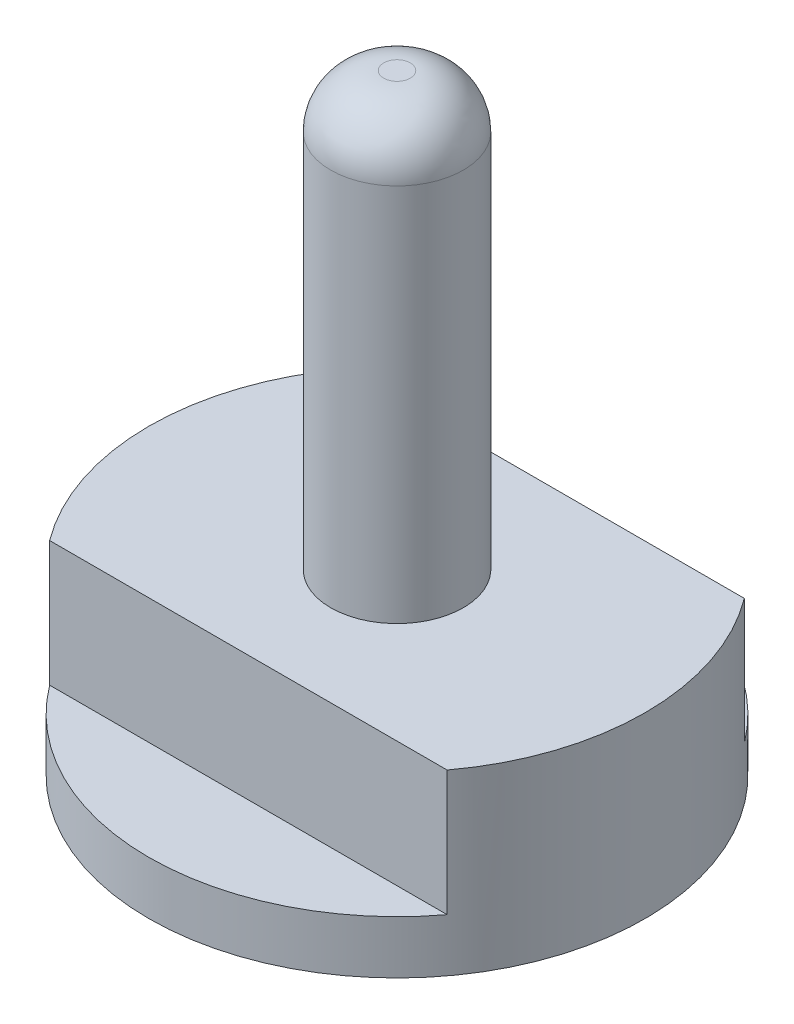
ISO-10303-21;
HEADER;
FILE_DESCRIPTION(('STEP AP214'),'2;1');
FILE_NAME('part.step','',(''),(''),'','','');
FILE_SCHEMA(('AUTOMOTIVE_DESIGN { 1 0 10303 214 1 1 1 1 }'));
ENDSEC;
DATA;
#1=APPLICATION_CONTEXT('core data for automotive mechanical design processes');
#2=APPLICATION_PROTOCOL_DEFINITION('international standard','automotive_design',2000,#1);
#3=PRODUCT_CONTEXT('',#1,'mechanical');
#4=PRODUCT('Part','Part','',(#3));
#5=PRODUCT_RELATED_PRODUCT_CATEGORY('part','',(#4));
#6=PRODUCT_DEFINITION_FORMATION('','',#4);
#7=PRODUCT_DEFINITION_CONTEXT('part definition',#1,'design');
#8=PRODUCT_DEFINITION('design','',#6,#7);
#9=PRODUCT_DEFINITION_SHAPE('','',#8);
#10=(LENGTH_UNIT() NAMED_UNIT(*) SI_UNIT(.MILLI.,.METRE.));
#11=(NAMED_UNIT(*) PLANE_ANGLE_UNIT() SI_UNIT($,.RADIAN.));
#12=(NAMED_UNIT(*) SI_UNIT($,.STERADIAN.) SOLID_ANGLE_UNIT());
#13=UNCERTAINTY_MEASURE_WITH_UNIT(LENGTH_MEASURE(1.E-05),#10,'distance_accuracy_value','');
#14=(GEOMETRIC_REPRESENTATION_CONTEXT(3) GLOBAL_UNCERTAINTY_ASSIGNED_CONTEXT((#13)) GLOBAL_UNIT_ASSIGNED_CONTEXT((#10,
#11,#12)) REPRESENTATION_CONTEXT('',''));
#15=CARTESIAN_POINT('',(0.,0.,0.));
#16=DIRECTION('',(0.,0.,1.));
#17=DIRECTION('',(1.,0.,0.));
#18=AXIS2_PLACEMENT_3D('',#15,#16,#17);
#19=CARTESIAN_POINT('',(3.74374478296798,-10.8987384591062,5.6));
#20=DIRECTION('',(0.,0.,-1.));
#21=DIRECTION('',(0.,1.,0.));
#22=AXIS2_PLACEMENT_3D('',#19,#20,#21);
#23=PLANE('',#22);
#24=DIRECTION('',(-1.,0.,0.));
#25=VECTOR('',#24,1.);
#26=CARTESIAN_POINT('',(3.74374478296798,0.999999999999999,5.6));
#27=LINE('',#26,#25);
#28=CARTESIAN_POINT('',(3.74374478296798,0.999999999999996,5.6));
#29=VERTEX_POINT('',#28);
#30=CARTESIAN_POINT('',(-3.74374478296798,0.999999999999996,5.6));
#31=VERTEX_POINT('',#30);
#32=EDGE_CURVE('E52',#29,#31,#27,.T.);
#33=ORIENTED_EDGE('',*,*,#32,.F.);
#34=DIRECTION('',(0.,1.,0.));
#35=VECTOR('',#34,1.);
#36=CARTESIAN_POINT('',(3.74374478296798,-10.8987384591062,5.6));
#37=LINE('',#36,#35);
#38=CARTESIAN_POINT('',(3.74374478296798,3.36,5.6));
#39=VERTEX_POINT('',#38);
#40=EDGE_CURVE('E98',#29,#39,#37,.T.);
#41=ORIENTED_EDGE('',*,*,#40,.T.);
#42=DIRECTION('',(-1.,0.,0.));
#43=VECTOR('',#42,1.);
#44=CARTESIAN_POINT('',(3.74374478296798,3.36,5.6));
#45=LINE('',#44,#43);
#46=CARTESIAN_POINT('',(-3.74374478296798,3.36,5.6));
#47=VERTEX_POINT('',#46);
#48=EDGE_CURVE('E175',#39,#47,#45,.T.);
#49=ORIENTED_EDGE('',*,*,#48,.T.);
#50=DIRECTION('',(0.,1.,0.));
#51=VECTOR('',#50,1.);
#52=CARTESIAN_POINT('',(-3.74374478296798,-10.8987384591062,5.6));
#53=LINE('',#52,#51);
#54=EDGE_CURVE('E57',#31,#47,#53,.T.);
#55=ORIENTED_EDGE('',*,*,#54,.F.);
#56=EDGE_LOOP('',(#33,#41,#49,#55));
#57=FACE_BOUND('',#56,.T.);
#58=ADVANCED_FACE('F37',(#57),#23,.F.);
#59=CARTESIAN_POINT('',(3.74374478296798,-10.8987384591062,0.));
#60=DIRECTION('',(0.,0.,-1.));
#61=DIRECTION('',(0.,1.,0.));
#62=AXIS2_PLACEMENT_3D('',#59,#60,#61);
#63=PLANE('',#62);
#64=DIRECTION('',(0.,1.,0.));
#65=VECTOR('',#64,1.);
#66=CARTESIAN_POINT('',(3.74374478296798,-10.8987384591062,0.));
#67=LINE('',#66,#65);
#68=CARTESIAN_POINT('',(3.743744782968,1.,0.));
#69=VERTEX_POINT('',#68);
#70=CARTESIAN_POINT('',(3.74374478296798,3.36,0.));
#71=VERTEX_POINT('',#70);
#72=EDGE_CURVE('E88',#69,#71,#67,.T.);
#73=ORIENTED_EDGE('',*,*,#72,.F.);
#74=DIRECTION('',(-1.,0.,0.));
#75=VECTOR('',#74,1.);
#76=CARTESIAN_POINT('',(3.74374478296798,0.999999999999999,0.));
#77=LINE('',#76,#75);
#78=CARTESIAN_POINT('',(-3.74374478296799,1.,0.));
#79=VERTEX_POINT('',#78);
#80=EDGE_CURVE('E75',#69,#79,#77,.T.);
#81=ORIENTED_EDGE('',*,*,#80,.T.);
#82=DIRECTION('',(0.,1.,0.));
#83=VECTOR('',#82,1.);
#84=CARTESIAN_POINT('',(-3.74374478296798,-10.8987384591062,0.));
#85=LINE('',#84,#83);
#86=CARTESIAN_POINT('',(-3.74374478296798,3.36,0.));
#87=VERTEX_POINT('',#86);
#88=EDGE_CURVE('E91',#79,#87,#85,.T.);
#89=ORIENTED_EDGE('',*,*,#88,.T.);
#90=DIRECTION('',(-1.,0.,0.));
#91=VECTOR('',#90,1.);
#92=CARTESIAN_POINT('',(3.74374478296798,3.36,0.));
#93=LINE('',#92,#91);
#94=EDGE_CURVE('E97',#71,#87,#93,.T.);
#95=ORIENTED_EDGE('',*,*,#94,.F.);
#96=EDGE_LOOP('',(#73,#81,#89,#95));
#97=FACE_BOUND('',#96,.T.);
#98=ADVANCED_FACE('F95',(#97),#63,.T.);
#99=CARTESIAN_POINT('',(0.,3.36,2.8));
#100=DIRECTION('',(0.,1.,0.));
#101=DIRECTION('',(0.,0.,1.));
#102=AXIS2_PLACEMENT_3D('',#99,#100,#101);
#103=PLANE('',#102);
#104=CARTESIAN_POINT('',(0.,3.36,2.8));
#105=DIRECTION('',(0.,1.,0.));
#106=DIRECTION('',(0.,0.,1.));
#107=AXIS2_PLACEMENT_3D('',#104,#105,#106);
#108=CIRCLE('',#107,1.25);
#109=CARTESIAN_POINT('',(0.,3.36,4.05));
#110=VERTEX_POINT('',#109);
#111=EDGE_CURVE('E167',#110,#110,#108,.T.);
#112=ORIENTED_EDGE('',*,*,#111,.F.);
#113=EDGE_LOOP('',(#112));
#114=FACE_BOUND('',#113,.T.);
#115=CARTESIAN_POINT('',(0.,3.36,2.8));
#116=DIRECTION('',(0.,1.,0.));
#117=DIRECTION('',(0.,0.,1.));
#118=AXIS2_PLACEMENT_3D('',#115,#116,#117);
#119=CIRCLE('',#118,4.675);
#120=EDGE_CURVE('E170',#87,#47,#119,.T.);
#121=ORIENTED_EDGE('',*,*,#120,.T.);
#122=ORIENTED_EDGE('',*,*,#48,.F.);
#123=CARTESIAN_POINT('',(0.,3.36,2.8));
#124=DIRECTION('',(0.,1.,0.));
#125=DIRECTION('',(0.,0.,1.));
#126=AXIS2_PLACEMENT_3D('',#123,#124,#125);
#127=CIRCLE('',#126,4.675);
#128=EDGE_CURVE('E177',#39,#71,#127,.T.);
#129=ORIENTED_EDGE('',*,*,#128,.T.);
#130=ORIENTED_EDGE('',*,*,#94,.T.);
#131=EDGE_LOOP('',(#121,#122,#129,#130));
#132=FACE_BOUND('',#131,.T.);
#133=ADVANCED_FACE('F131',(#114,#132),#103,.T.);
#134=CARTESIAN_POINT('',(0.,-10.8987384591062,2.8));
#135=DIRECTION('',(0.,1.,0.));
#136=DIRECTION('',(0.,0.,1.));
#137=AXIS2_PLACEMENT_3D('',#134,#135,#136);
#138=CYLINDRICAL_SURFACE('',#137,4.675);
#139=ORIENTED_EDGE('',*,*,#40,.F.);
#140=CARTESIAN_POINT('',(0.,1.,2.8));
#141=DIRECTION('',(0.,-1.,0.));
#142=DIRECTION('',(0.,0.,-1.));
#143=AXIS2_PLACEMENT_3D('',#140,#141,#142);
#144=CIRCLE('',#143,4.67500000000001);
#145=EDGE_CURVE('E82',#29,#31,#144,.T.);
#146=ORIENTED_EDGE('',*,*,#145,.T.);
#147=ORIENTED_EDGE('',*,*,#54,.T.);
#148=ORIENTED_EDGE('',*,*,#120,.F.);
#149=ORIENTED_EDGE('',*,*,#88,.F.);
#150=EDGE_CURVE('E78',#79,#69,#144,.T.);
#151=ORIENTED_EDGE('',*,*,#150,.T.);
#152=ORIENTED_EDGE('',*,*,#72,.T.);
#153=ORIENTED_EDGE('',*,*,#128,.F.);
#154=EDGE_LOOP('',(#139,#146,#147,#148,#149,#151,#152,#153));
#155=FACE_BOUND('',#154,.T.);
#156=CARTESIAN_POINT('',(0.,0.,2.8));
#157=DIRECTION('',(0.,1.,0.));
#158=DIRECTION('',(0.,0.,1.));
#159=AXIS2_PLACEMENT_3D('',#156,#157,#158);
#160=CIRCLE('',#159,4.675);
#161=CARTESIAN_POINT('',(0.,0.,7.475));
#162=VERTEX_POINT('',#161);
#163=EDGE_CURVE('E100',#162,#162,#160,.F.);
#164=ORIENTED_EDGE('',*,*,#163,.F.);
#165=EDGE_LOOP('',(#164));
#166=FACE_BOUND('',#165,.T.);
#167=ADVANCED_FACE('F85',(#155,#166),#138,.T.);
#168=CARTESIAN_POINT('',(0.,0.,2.8));
#169=DIRECTION('',(0.,1.,0.));
#170=DIRECTION('',(-1.,0.,0.));
#171=AXIS2_PLACEMENT_3D('',#168,#169,#170);
#172=PLANE('',#171);
#173=CARTESIAN_POINT('',(0.,0.,2.8));
#174=DIRECTION('',(0.,1.,0.));
#175=DIRECTION('',(0.,0.,1.));
#176=AXIS2_PLACEMENT_3D('',#173,#174,#175);
#177=CIRCLE('',#176,1.67500000000001);
#178=CARTESIAN_POINT('',(0.,0.,4.47500000000001));
#179=VERTEX_POINT('',#178);
#180=EDGE_CURVE('E11',#179,#179,#177,.F.);
#181=ORIENTED_EDGE('',*,*,#180,.F.);
#182=EDGE_LOOP('',(#181));
#183=FACE_BOUND('',#182,.T.);
#184=ORIENTED_EDGE('',*,*,#163,.T.);
#185=EDGE_LOOP('',(#184));
#186=FACE_BOUND('',#185,.T.);
#187=ADVANCED_FACE('F124',(#183,#186),#172,.F.);
#188=CARTESIAN_POINT('',(0.,11.5,2.8));
#189=DIRECTION('',(0.,-1.,0.));
#190=DIRECTION('',(0.,0.,-1.));
#191=AXIS2_PLACEMENT_3D('',#188,#189,#190);
#192=CYLINDRICAL_SURFACE('',#191,1.25);
#193=CARTESIAN_POINT('',(0.,10.5,2.8));
#194=DIRECTION('',(0.,1.,0.));
#195=DIRECTION('',(0.,0.,1.));
#196=AXIS2_PLACEMENT_3D('',#193,#194,#195);
#197=CIRCLE('',#196,1.25);
#198=CARTESIAN_POINT('',(0.,10.5,4.05));
#199=VERTEX_POINT('',#198);
#200=EDGE_CURVE('E45',#199,#199,#197,.F.);
#201=ORIENTED_EDGE('',*,*,#200,.T.);
#202=EDGE_LOOP('',(#201));
#203=FACE_BOUND('',#202,.T.);
#204=ORIENTED_EDGE('',*,*,#111,.T.);
#205=EDGE_LOOP('',(#204));
#206=FACE_BOUND('',#205,.T.);
#207=ADVANCED_FACE('F111',(#203,#206),#192,.T.);
#208=CARTESIAN_POINT('',(0.,11.5,2.8));
#209=DIRECTION('',(0.,1.,0.));
#210=DIRECTION('',(0.,0.,1.));
#211=AXIS2_PLACEMENT_3D('',#208,#209,#210);
#212=PLANE('',#211);
#213=CARTESIAN_POINT('',(0.,11.5,2.8));
#214=DIRECTION('',(0.,1.,0.));
#215=DIRECTION('',(0.,0.,1.));
#216=AXIS2_PLACEMENT_3D('',#213,#214,#215);
#217=CIRCLE('',#216,0.25);
#218=CARTESIAN_POINT('',(0.,11.5,3.05));
#219=VERTEX_POINT('',#218);
#220=EDGE_CURVE('E106',#219,#219,#217,.T.);
#221=ORIENTED_EDGE('',*,*,#220,.T.);
#222=EDGE_LOOP('',(#221));
#223=FACE_BOUND('',#222,.T.);
#224=ADVANCED_FACE('F116',(#223),#212,.T.);
#225=CARTESIAN_POINT('',(0.,10.5,2.8));
#226=DIRECTION('',(0.,1.,0.));
#227=DIRECTION('',(0.,0.,1.));
#228=AXIS2_PLACEMENT_3D('',#225,#226,#227);
#229=DEGENERATE_TOROIDAL_SURFACE('',#228,0.25,1.,.T.);
#230=ORIENTED_EDGE('',*,*,#200,.F.);
#231=EDGE_LOOP('',(#230));
#232=FACE_BOUND('',#231,.T.);
#233=ORIENTED_EDGE('',*,*,#220,.F.);
#234=EDGE_LOOP('',(#233));
#235=FACE_BOUND('',#234,.T.);
#236=ADVANCED_FACE('F39',(#232,#235),#229,.T.);
#237=CARTESIAN_POINT('',(0.,1.,2.8));
#238=DIRECTION('',(0.,-1.,0.));
#239=DIRECTION('',(0.,0.,-1.));
#240=AXIS2_PLACEMENT_3D('',#237,#238,#239);
#241=PLANE('',#240);
#242=ORIENTED_EDGE('',*,*,#80,.F.);
#243=ORIENTED_EDGE('',*,*,#150,.F.);
#244=EDGE_LOOP('',(#242,#243));
#245=FACE_BOUND('',#244,.T.);
#246=ADVANCED_FACE('F77',(#245),#241,.F.);
#247=ORIENTED_EDGE('',*,*,#145,.F.);
#248=ORIENTED_EDGE('',*,*,#32,.T.);
#249=EDGE_LOOP('',(#247,#248));
#250=FACE_BOUND('',#249,.T.);
#251=ADVANCED_FACE('F183',(#250),#241,.F.);
#252=CARTESIAN_POINT('',(0.,-2.,2.8));
#253=DIRECTION('',(0.,-1.,0.));
#254=DIRECTION('',(0.,0.,-1.));
#255=AXIS2_PLACEMENT_3D('',#252,#253,#254);
#256=PLANE('',#255);
#257=CARTESIAN_POINT('',(0.,-2.,2.8));
#258=DIRECTION('',(0.,-1.,0.));
#259=DIRECTION('',(0.,0.,-1.));
#260=AXIS2_PLACEMENT_3D('',#257,#258,#259);
#261=CIRCLE('',#260,1.67500000000001);
#262=CARTESIAN_POINT('',(0.,-2.,1.12499999999999));
#263=VERTEX_POINT('',#262);
#264=EDGE_CURVE('E92',#263,#263,#261,.T.);
#265=ORIENTED_EDGE('',*,*,#264,.T.);
#266=EDGE_LOOP('',(#265));
#267=FACE_BOUND('',#266,.T.);
#268=CARTESIAN_POINT('',(0.,-2.,2.8));
#269=DIRECTION('',(0.,-1.,0.));
#270=DIRECTION('',(0.,0.,-1.));
#271=AXIS2_PLACEMENT_3D('',#268,#269,#270);
#272=CIRCLE('',#271,1.17500000000001);
#273=CARTESIAN_POINT('',(0.,-2.,1.62499999999999));
#274=VERTEX_POINT('',#273);
#275=EDGE_CURVE('E159',#274,#274,#272,.T.);
#276=ORIENTED_EDGE('',*,*,#275,.F.);
#277=EDGE_LOOP('',(#276));
#278=FACE_BOUND('',#277,.T.);
#279=ADVANCED_FACE('F185',(#267,#278),#256,.T.);
#280=CARTESIAN_POINT('',(0.,-2.,2.8));
#281=DIRECTION('',(0.,1.,0.));
#282=DIRECTION('',(0.,0.,1.));
#283=AXIS2_PLACEMENT_3D('',#280,#281,#282);
#284=CYLINDRICAL_SURFACE('',#283,1.67500000000001);
#285=ORIENTED_EDGE('',*,*,#264,.F.);
#286=EDGE_LOOP('',(#285));
#287=FACE_BOUND('',#286,.T.);
#288=ORIENTED_EDGE('',*,*,#180,.T.);
#289=EDGE_LOOP('',(#288));
#290=FACE_BOUND('',#289,.T.);
#291=ADVANCED_FACE('F152',(#287,#290),#284,.T.);
#292=CARTESIAN_POINT('',(0.,-2.,2.8));
#293=DIRECTION('',(0.,1.,0.));
#294=DIRECTION('',(0.,0.,1.));
#295=AXIS2_PLACEMENT_3D('',#292,#293,#294);
#296=CYLINDRICAL_SURFACE('',#295,1.17500000000001);
#297=ORIENTED_EDGE('',*,*,#275,.T.);
#298=EDGE_LOOP('',(#297));
#299=FACE_BOUND('',#298,.T.);
#300=CARTESIAN_POINT('',(0.,0.,2.8));
#301=DIRECTION('',(0.,-1.,0.));
#302=DIRECTION('',(0.,0.,-1.));
#303=AXIS2_PLACEMENT_3D('',#300,#301,#302);
#304=CIRCLE('',#303,1.17500000000001);
#305=CARTESIAN_POINT('',(0.,0.,1.62499999999999));
#306=VERTEX_POINT('',#305);
#307=EDGE_CURVE('E157',#306,#306,#304,.T.);
#308=ORIENTED_EDGE('',*,*,#307,.F.);
#309=EDGE_LOOP('',(#308));
#310=FACE_BOUND('',#309,.T.);
#311=ADVANCED_FACE('F147',(#299,#310),#296,.F.);
#312=ORIENTED_EDGE('',*,*,#307,.T.);
#313=EDGE_LOOP('',(#312));
#314=FACE_BOUND('',#313,.T.);
#315=ADVANCED_FACE('F141',(#314),#172,.F.);
#316=CLOSED_SHELL('',(#58,#98,#133,#167,#187,#207,#224,#236,#246,#251,#279,#291,#311,#315));
#317=MANIFOLD_SOLID_BREP('B2',#316);
#318=ADVANCED_BREP_SHAPE_REPRESENTATION('',(#18,#317),#14);
#319=SHAPE_DEFINITION_REPRESENTATION(#9,#318);
ENDSEC;
END-ISO-10303-21;
